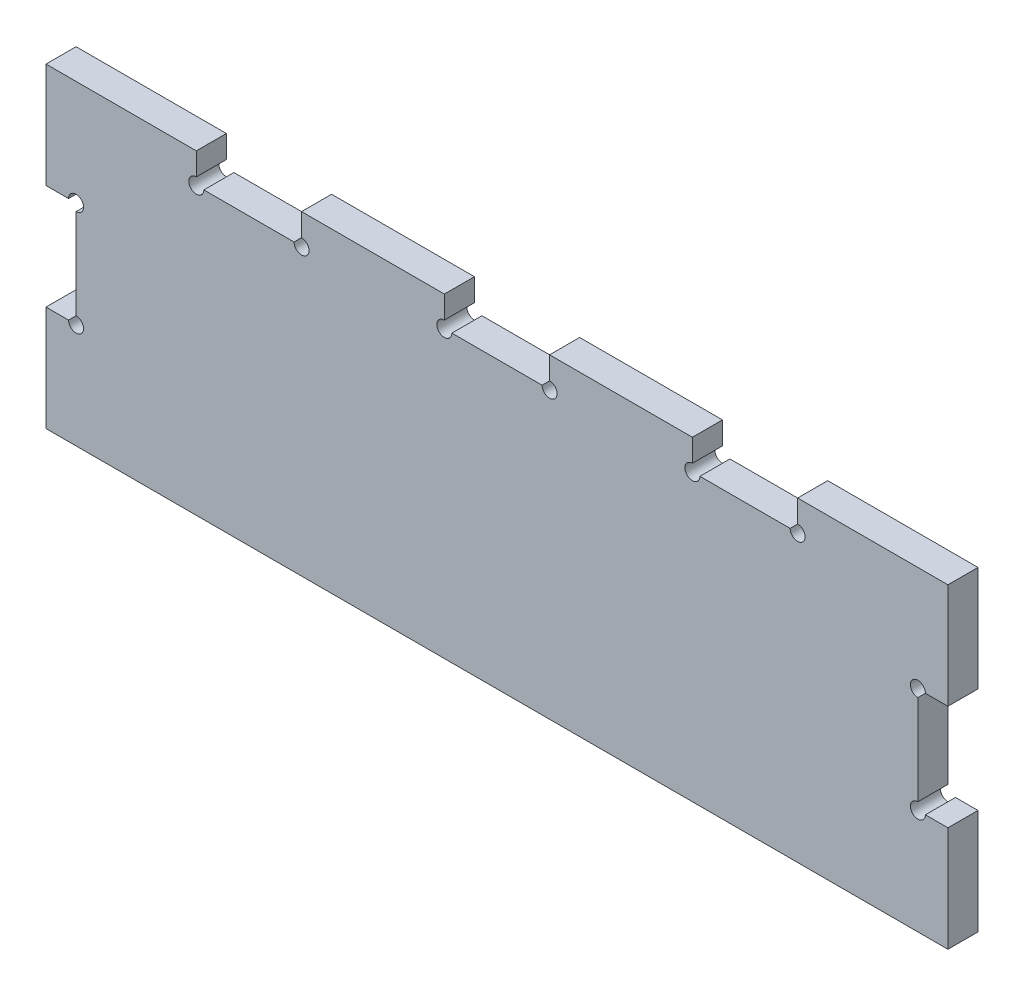
ISO-10303-21;
HEADER;
FILE_DESCRIPTION(('STEP AP214'),'2;1');
FILE_NAME('part.step','',(''),(''),'','','');
FILE_SCHEMA(('AUTOMOTIVE_DESIGN { 1 0 10303 214 1 1 1 1 }'));
ENDSEC;
DATA;
#1=APPLICATION_CONTEXT('core data for automotive mechanical design processes');
#2=APPLICATION_PROTOCOL_DEFINITION('international standard','automotive_design',2000,#1);
#3=PRODUCT_CONTEXT('',#1,'mechanical');
#4=PRODUCT('Part','Part','',(#3));
#5=PRODUCT_RELATED_PRODUCT_CATEGORY('part','',(#4));
#6=PRODUCT_DEFINITION_FORMATION('','',#4);
#7=PRODUCT_DEFINITION_CONTEXT('part definition',#1,'design');
#8=PRODUCT_DEFINITION('design','',#6,#7);
#9=PRODUCT_DEFINITION_SHAPE('','',#8);
#10=(LENGTH_UNIT() NAMED_UNIT(*) SI_UNIT(.MILLI.,.METRE.));
#11=(NAMED_UNIT(*) PLANE_ANGLE_UNIT() SI_UNIT($,.RADIAN.));
#12=(NAMED_UNIT(*) SI_UNIT($,.STERADIAN.) SOLID_ANGLE_UNIT());
#13=UNCERTAINTY_MEASURE_WITH_UNIT(LENGTH_MEASURE(1.E-05),#10,'distance_accuracy_value','');
#14=(GEOMETRIC_REPRESENTATION_CONTEXT(3) GLOBAL_UNCERTAINTY_ASSIGNED_CONTEXT((#13)) GLOBAL_UNIT_ASSIGNED_CONTEXT((#10,
#11,#12)) REPRESENTATION_CONTEXT('',''));
#15=CARTESIAN_POINT('',(0.,0.,0.));
#16=DIRECTION('',(0.,0.,1.));
#17=DIRECTION('',(1.,0.,0.));
#18=AXIS2_PLACEMENT_3D('',#15,#16,#17);
#19=CARTESIAN_POINT('',(0.,21.,2.));
#20=DIRECTION('',(0.,-1.,0.));
#21=DIRECTION('',(0.,0.,-1.));
#22=AXIS2_PLACEMENT_3D('',#19,#20,#21);
#23=PLANE('',#22);
#24=DIRECTION('',(-1.,0.,0.));
#25=VECTOR('',#24,1.);
#26=CARTESIAN_POINT('',(0.,21.,2.));
#27=LINE('',#26,#25);
#28=CARTESIAN_POINT('',(10.,21.,2.));
#29=VERTEX_POINT('',#28);
#30=CARTESIAN_POINT('',(0.,21.,2.));
#31=VERTEX_POINT('',#30);
#32=EDGE_CURVE('E440',#29,#31,#27,.T.);
#33=ORIENTED_EDGE('',*,*,#32,.F.);
#34=DIRECTION('',(0.,0.,1.));
#35=VECTOR('',#34,1.);
#36=CARTESIAN_POINT('',(10.,21.,0.));
#37=LINE('',#36,#35);
#38=CARTESIAN_POINT('',(10.,21.,0.));
#39=VERTEX_POINT('',#38);
#40=EDGE_CURVE('E303',#39,#29,#37,.T.);
#41=ORIENTED_EDGE('',*,*,#40,.F.);
#42=DIRECTION('',(-1.,0.,0.));
#43=VECTOR('',#42,1.);
#44=CARTESIAN_POINT('',(0.,21.,0.));
#45=LINE('',#44,#43);
#46=CARTESIAN_POINT('',(0.,21.,0.));
#47=VERTEX_POINT('',#46);
#48=EDGE_CURVE('E459',#39,#47,#45,.T.);
#49=ORIENTED_EDGE('',*,*,#48,.T.);
#50=DIRECTION('',(0.,0.,-1.));
#51=VECTOR('',#50,1.);
#52=CARTESIAN_POINT('',(0.,21.,2.));
#53=LINE('',#52,#51);
#54=EDGE_CURVE('E445',#31,#47,#53,.T.);
#55=ORIENTED_EDGE('',*,*,#54,.F.);
#56=EDGE_LOOP('',(#33,#41,#49,#55));
#57=FACE_BOUND('',#56,.T.);
#58=ADVANCED_FACE('F39',(#57),#23,.F.);
#59=CARTESIAN_POINT('',(26.5,21.,0.));
#60=VERTEX_POINT('',#59);
#61=CARTESIAN_POINT('',(17.,21.,0.));
#62=VERTEX_POINT('',#61);
#63=EDGE_CURVE('E689',#60,#62,#45,.T.);
#64=ORIENTED_EDGE('',*,*,#63,.T.);
#65=DIRECTION('',(0.,0.,1.));
#66=VECTOR('',#65,1.);
#67=CARTESIAN_POINT('',(17.,21.,0.));
#68=LINE('',#67,#66);
#69=CARTESIAN_POINT('',(17.,21.,2.));
#70=VERTEX_POINT('',#69);
#71=EDGE_CURVE('E307',#62,#70,#68,.T.);
#72=ORIENTED_EDGE('',*,*,#71,.T.);
#73=CARTESIAN_POINT('',(26.5,21.,2.));
#74=VERTEX_POINT('',#73);
#75=EDGE_CURVE('E289',#74,#70,#27,.T.);
#76=ORIENTED_EDGE('',*,*,#75,.F.);
#77=DIRECTION('',(0.,0.,1.));
#78=VECTOR('',#77,1.);
#79=CARTESIAN_POINT('',(26.5,21.,0.));
#80=LINE('',#79,#78);
#81=EDGE_CURVE('E334',#60,#74,#80,.T.);
#82=ORIENTED_EDGE('',*,*,#81,.F.);
#83=EDGE_LOOP('',(#64,#72,#76,#82));
#84=FACE_BOUND('',#83,.T.);
#85=ADVANCED_FACE('F714',(#84),#23,.F.);
#86=CARTESIAN_POINT('',(43.,21.,0.));
#87=VERTEX_POINT('',#86);
#88=CARTESIAN_POINT('',(33.5,21.,0.));
#89=VERTEX_POINT('',#88);
#90=EDGE_CURVE('E464',#87,#89,#45,.T.);
#91=ORIENTED_EDGE('',*,*,#90,.T.);
#92=DIRECTION('',(0.,0.,1.));
#93=VECTOR('',#92,1.);
#94=CARTESIAN_POINT('',(33.5,21.,0.));
#95=LINE('',#94,#93);
#96=CARTESIAN_POINT('',(33.5,21.,2.));
#97=VERTEX_POINT('',#96);
#98=EDGE_CURVE('E322',#89,#97,#95,.T.);
#99=ORIENTED_EDGE('',*,*,#98,.T.);
#100=CARTESIAN_POINT('',(43.,21.,2.));
#101=VERTEX_POINT('',#100);
#102=EDGE_CURVE('E446',#101,#97,#27,.T.);
#103=ORIENTED_EDGE('',*,*,#102,.F.);
#104=DIRECTION('',(0.,0.,1.));
#105=VECTOR('',#104,1.);
#106=CARTESIAN_POINT('',(43.,21.,0.));
#107=LINE('',#106,#105);
#108=EDGE_CURVE('E328',#87,#101,#107,.T.);
#109=ORIENTED_EDGE('',*,*,#108,.F.);
#110=EDGE_LOOP('',(#91,#99,#103,#109));
#111=FACE_BOUND('',#110,.T.);
#112=ADVANCED_FACE('F559',(#111),#23,.F.);
#113=CARTESIAN_POINT('',(0.,0.,2.));
#114=DIRECTION('',(1.,0.,0.));
#115=DIRECTION('',(0.,0.,-1.));
#116=AXIS2_PLACEMENT_3D('',#113,#114,#115);
#117=PLANE('',#116);
#118=DIRECTION('',(0.,-1.,0.));
#119=VECTOR('',#118,1.);
#120=CARTESIAN_POINT('',(0.,0.,0.));
#121=LINE('',#120,#119);
#122=CARTESIAN_POINT('',(0.,14.,0.));
#123=VERTEX_POINT('',#122);
#124=EDGE_CURVE('E447',#47,#123,#121,.T.);
#125=ORIENTED_EDGE('',*,*,#124,.T.);
#126=DIRECTION('',(0.,0.,1.));
#127=VECTOR('',#126,1.);
#128=CARTESIAN_POINT('',(0.,14.,0.));
#129=LINE('',#128,#127);
#130=CARTESIAN_POINT('',(0.,14.,2.));
#131=VERTEX_POINT('',#130);
#132=EDGE_CURVE('E393',#123,#131,#129,.T.);
#133=ORIENTED_EDGE('',*,*,#132,.T.);
#134=DIRECTION('',(0.,-1.,0.));
#135=VECTOR('',#134,1.);
#136=CARTESIAN_POINT('',(0.,0.,2.));
#137=LINE('',#136,#135);
#138=EDGE_CURVE('E427',#31,#131,#137,.T.);
#139=ORIENTED_EDGE('',*,*,#138,.F.);
#140=ORIENTED_EDGE('',*,*,#54,.T.);
#141=EDGE_LOOP('',(#125,#133,#139,#140));
#142=FACE_BOUND('',#141,.T.);
#143=ADVANCED_FACE('F693',(#142),#117,.F.);
#144=CARTESIAN_POINT('',(60.,0.,2.));
#145=DIRECTION('',(-1.,0.,0.));
#146=DIRECTION('',(0.,0.,1.));
#147=AXIS2_PLACEMENT_3D('',#144,#145,#146);
#148=PLANE('',#147);
#149=DIRECTION('',(0.,1.,0.));
#150=VECTOR('',#149,1.);
#151=CARTESIAN_POINT('',(60.,0.,0.));
#152=LINE('',#151,#150);
#153=CARTESIAN_POINT('',(60.,0.,0.));
#154=VERTEX_POINT('',#153);
#155=CARTESIAN_POINT('',(60.,7.00000000000002,0.));
#156=VERTEX_POINT('',#155);
#157=EDGE_CURVE('E455',#154,#156,#152,.T.);
#158=ORIENTED_EDGE('',*,*,#157,.T.);
#159=DIRECTION('',(0.,0.,1.));
#160=VECTOR('',#159,1.);
#161=CARTESIAN_POINT('',(60.,7.00000000000002,0.));
#162=LINE('',#161,#160);
#163=CARTESIAN_POINT('',(60.,7.00000000000002,2.));
#164=VERTEX_POINT('',#163);
#165=EDGE_CURVE('E387',#156,#164,#162,.T.);
#166=ORIENTED_EDGE('',*,*,#165,.T.);
#167=DIRECTION('',(0.,1.,0.));
#168=VECTOR('',#167,1.);
#169=CARTESIAN_POINT('',(60.,0.,2.));
#170=LINE('',#169,#168);
#171=CARTESIAN_POINT('',(60.,0.,2.));
#172=VERTEX_POINT('',#171);
#173=EDGE_CURVE('E436',#172,#164,#170,.T.);
#174=ORIENTED_EDGE('',*,*,#173,.F.);
#175=DIRECTION('',(0.,0.,-1.));
#176=VECTOR('',#175,1.);
#177=CARTESIAN_POINT('',(60.,0.,2.));
#178=LINE('',#177,#176);
#179=EDGE_CURVE('E472',#172,#154,#178,.T.);
#180=ORIENTED_EDGE('',*,*,#179,.T.);
#181=EDGE_LOOP('',(#158,#166,#174,#180));
#182=FACE_BOUND('',#181,.T.);
#183=ADVANCED_FACE('F673',(#182),#148,.F.);
#184=CARTESIAN_POINT('',(0.,7.,2.));
#185=VERTEX_POINT('',#184);
#186=CARTESIAN_POINT('',(0.,0.,2.));
#187=VERTEX_POINT('',#186);
#188=EDGE_CURVE('E432',#185,#187,#137,.T.);
#189=ORIENTED_EDGE('',*,*,#188,.F.);
#190=DIRECTION('',(0.,0.,1.));
#191=VECTOR('',#190,1.);
#192=CARTESIAN_POINT('',(0.,7.,0.));
#193=LINE('',#192,#191);
#194=CARTESIAN_POINT('',(0.,7.,0.));
#195=VERTEX_POINT('',#194);
#196=EDGE_CURVE('E381',#195,#185,#193,.T.);
#197=ORIENTED_EDGE('',*,*,#196,.F.);
#198=CARTESIAN_POINT('',(0.,0.,0.));
#199=VERTEX_POINT('',#198);
#200=EDGE_CURVE('E397',#195,#199,#121,.T.);
#201=ORIENTED_EDGE('',*,*,#200,.T.);
#202=DIRECTION('',(0.,0.,-1.));
#203=VECTOR('',#202,1.);
#204=CARTESIAN_POINT('',(0.,0.,2.));
#205=LINE('',#204,#203);
#206=EDGE_CURVE('E476',#187,#199,#205,.T.);
#207=ORIENTED_EDGE('',*,*,#206,.F.);
#208=EDGE_LOOP('',(#189,#197,#201,#207));
#209=FACE_BOUND('',#208,.T.);
#210=ADVANCED_FACE('F41',(#209),#117,.F.);
#211=CARTESIAN_POINT('',(0.,0.,2.));
#212=DIRECTION('',(0.,1.,0.));
#213=DIRECTION('',(0.,0.,1.));
#214=AXIS2_PLACEMENT_3D('',#211,#212,#213);
#215=PLANE('',#214);
#216=DIRECTION('',(1.,0.,0.));
#217=VECTOR('',#216,1.);
#218=CARTESIAN_POINT('',(0.,0.,0.));
#219=LINE('',#218,#217);
#220=EDGE_CURVE('E451',#199,#154,#219,.T.);
#221=ORIENTED_EDGE('',*,*,#220,.T.);
#222=ORIENTED_EDGE('',*,*,#179,.F.);
#223=DIRECTION('',(1.,0.,0.));
#224=VECTOR('',#223,1.);
#225=CARTESIAN_POINT('',(0.,0.,2.));
#226=LINE('',#225,#224);
#227=EDGE_CURVE('E431',#187,#172,#226,.T.);
#228=ORIENTED_EDGE('',*,*,#227,.F.);
#229=ORIENTED_EDGE('',*,*,#206,.T.);
#230=EDGE_LOOP('',(#221,#222,#228,#229));
#231=FACE_BOUND('',#230,.T.);
#232=ADVANCED_FACE('F680',(#231),#215,.F.);
#233=CARTESIAN_POINT('',(60.,14.,2.));
#234=VERTEX_POINT('',#233);
#235=CARTESIAN_POINT('',(60.,21.,2.));
#236=VERTEX_POINT('',#235);
#237=EDGE_CURVE('E435',#234,#236,#170,.T.);
#238=ORIENTED_EDGE('',*,*,#237,.F.);
#239=DIRECTION('',(0.,0.,1.));
#240=VECTOR('',#239,1.);
#241=CARTESIAN_POINT('',(60.,14.,0.));
#242=LINE('',#241,#240);
#243=CARTESIAN_POINT('',(60.,14.,0.));
#244=VERTEX_POINT('',#243);
#245=EDGE_CURVE('E412',#244,#234,#242,.T.);
#246=ORIENTED_EDGE('',*,*,#245,.F.);
#247=CARTESIAN_POINT('',(60.,21.,0.));
#248=VERTEX_POINT('',#247);
#249=EDGE_CURVE('E454',#244,#248,#152,.T.);
#250=ORIENTED_EDGE('',*,*,#249,.T.);
#251=DIRECTION('',(0.,0.,-1.));
#252=VECTOR('',#251,1.);
#253=CARTESIAN_POINT('',(60.,21.,2.));
#254=LINE('',#253,#252);
#255=EDGE_CURVE('E468',#236,#248,#254,.T.);
#256=ORIENTED_EDGE('',*,*,#255,.F.);
#257=EDGE_LOOP('',(#238,#246,#250,#256));
#258=FACE_BOUND('',#257,.T.);
#259=ADVANCED_FACE('F724',(#258),#148,.F.);
#260=CARTESIAN_POINT('',(50.,21.,0.));
#261=VERTEX_POINT('',#260);
#262=EDGE_CURVE('E460',#248,#261,#45,.T.);
#263=ORIENTED_EDGE('',*,*,#262,.T.);
#264=DIRECTION('',(0.,0.,1.));
#265=VECTOR('',#264,1.);
#266=CARTESIAN_POINT('',(50.,21.,0.));
#267=LINE('',#266,#265);
#268=CARTESIAN_POINT('',(50.,21.,2.));
#269=VERTEX_POINT('',#268);
#270=EDGE_CURVE('E352',#261,#269,#267,.T.);
#271=ORIENTED_EDGE('',*,*,#270,.T.);
#272=EDGE_CURVE('E441',#236,#269,#27,.T.);
#273=ORIENTED_EDGE('',*,*,#272,.F.);
#274=ORIENTED_EDGE('',*,*,#255,.T.);
#275=EDGE_LOOP('',(#263,#271,#273,#274));
#276=FACE_BOUND('',#275,.T.);
#277=ADVANCED_FACE('F716',(#276),#23,.F.);
#278=CARTESIAN_POINT('',(0.,0.,2.));
#279=DIRECTION('',(0.,0.,-1.));
#280=DIRECTION('',(-1.,0.,0.));
#281=AXIS2_PLACEMENT_3D('',#278,#279,#280);
#282=PLANE('',#281);
#283=DIRECTION('',(1.,0.,0.));
#284=VECTOR('',#283,1.);
#285=CARTESIAN_POINT('',(10.,19.,2.));
#286=LINE('',#285,#284);
#287=CARTESIAN_POINT('',(10.5,19.,2.));
#288=VERTEX_POINT('',#287);
#289=CARTESIAN_POINT('',(16.5,19.,2.));
#290=VERTEX_POINT('',#289);
#291=EDGE_CURVE('E292',#288,#290,#286,.T.);
#292=ORIENTED_EDGE('',*,*,#291,.F.);
#293=CARTESIAN_POINT('',(10.,19.,2.));
#294=DIRECTION('',(0.,0.,1.));
#295=DIRECTION('',(1.,0.,0.));
#296=AXIS2_PLACEMENT_3D('',#293,#294,#295);
#297=CIRCLE('',#296,0.5);
#298=CARTESIAN_POINT('',(10.,19.5,2.));
#299=VERTEX_POINT('',#298);
#300=EDGE_CURVE('E543',#299,#288,#297,.T.);
#301=ORIENTED_EDGE('',*,*,#300,.F.);
#302=DIRECTION('',(0.,-1.,0.));
#303=VECTOR('',#302,1.);
#304=CARTESIAN_POINT('',(10.,21.,2.));
#305=LINE('',#304,#303);
#306=EDGE_CURVE('E299',#29,#299,#305,.T.);
#307=ORIENTED_EDGE('',*,*,#306,.F.);
#308=ORIENTED_EDGE('',*,*,#32,.T.);
#309=ORIENTED_EDGE('',*,*,#138,.T.);
#310=DIRECTION('',(-1.,0.,0.));
#311=VECTOR('',#310,1.);
#312=CARTESIAN_POINT('',(0.,14.,2.));
#313=LINE('',#312,#311);
#314=CARTESIAN_POINT('',(1.5,14.,2.));
#315=VERTEX_POINT('',#314);
#316=EDGE_CURVE('E374',#315,#131,#313,.T.);
#317=ORIENTED_EDGE('',*,*,#316,.F.);
#318=CARTESIAN_POINT('',(2.,14.,2.));
#319=DIRECTION('',(0.,0.,1.));
#320=DIRECTION('',(1.,0.,0.));
#321=AXIS2_PLACEMENT_3D('',#318,#319,#320);
#322=CIRCLE('',#321,0.5);
#323=CARTESIAN_POINT('',(2.,13.5,2.));
#324=VERTEX_POINT('',#323);
#325=EDGE_CURVE('E615',#324,#315,#322,.T.);
#326=ORIENTED_EDGE('',*,*,#325,.F.);
#327=DIRECTION('',(0.,1.,0.));
#328=VECTOR('',#327,1.);
#329=CARTESIAN_POINT('',(2.,14.,2.));
#330=LINE('',#329,#328);
#331=CARTESIAN_POINT('',(2.,7.5,2.));
#332=VERTEX_POINT('',#331);
#333=EDGE_CURVE('E386',#332,#324,#330,.T.);
#334=ORIENTED_EDGE('',*,*,#333,.F.);
#335=CARTESIAN_POINT('',(2.,7.,2.));
#336=DIRECTION('',(0.,0.,1.));
#337=DIRECTION('',(1.,0.,0.));
#338=AXIS2_PLACEMENT_3D('',#335,#336,#337);
#339=CIRCLE('',#338,0.5);
#340=CARTESIAN_POINT('',(1.5,7.,2.));
#341=VERTEX_POINT('',#340);
#342=EDGE_CURVE('E598',#341,#332,#339,.T.);
#343=ORIENTED_EDGE('',*,*,#342,.F.);
#344=DIRECTION('',(1.,0.,0.));
#345=VECTOR('',#344,1.);
#346=CARTESIAN_POINT('',(0.,7.,2.));
#347=LINE('',#346,#345);
#348=EDGE_CURVE('E382',#185,#341,#347,.T.);
#349=ORIENTED_EDGE('',*,*,#348,.F.);
#350=ORIENTED_EDGE('',*,*,#188,.T.);
#351=ORIENTED_EDGE('',*,*,#227,.T.);
#352=ORIENTED_EDGE('',*,*,#173,.T.);
#353=DIRECTION('',(1.,0.,0.));
#354=VECTOR('',#353,1.);
#355=CARTESIAN_POINT('',(60.,7.00000000000002,2.));
#356=LINE('',#355,#354);
#357=CARTESIAN_POINT('',(58.5,7.00000000000002,2.));
#358=VERTEX_POINT('',#357);
#359=EDGE_CURVE('E405',#358,#164,#356,.T.);
#360=ORIENTED_EDGE('',*,*,#359,.F.);
#361=CARTESIAN_POINT('',(58.,7.00000000000002,2.));
#362=DIRECTION('',(0.,0.,1.));
#363=DIRECTION('',(1.,0.,0.));
#364=AXIS2_PLACEMENT_3D('',#361,#362,#363);
#365=CIRCLE('',#364,0.5);
#366=CARTESIAN_POINT('',(58.,7.50000000000002,2.));
#367=VERTEX_POINT('',#366);
#368=EDGE_CURVE('E661',#367,#358,#365,.T.);
#369=ORIENTED_EDGE('',*,*,#368,.F.);
#370=DIRECTION('',(0.,-1.,0.));
#371=VECTOR('',#370,1.);
#372=CARTESIAN_POINT('',(58.,14.,2.));
#373=LINE('',#372,#371);
#374=CARTESIAN_POINT('',(58.,13.5,2.));
#375=VERTEX_POINT('',#374);
#376=EDGE_CURVE('E416',#375,#367,#373,.T.);
#377=ORIENTED_EDGE('',*,*,#376,.F.);
#378=CARTESIAN_POINT('',(58.,14.,2.));
#379=DIRECTION('',(0.,0.,1.));
#380=DIRECTION('',(1.,0.,0.));
#381=AXIS2_PLACEMENT_3D('',#378,#379,#380);
#382=CIRCLE('',#381,0.5);
#383=CARTESIAN_POINT('',(58.5,14.,2.));
#384=VERTEX_POINT('',#383);
#385=EDGE_CURVE('E626',#384,#375,#382,.T.);
#386=ORIENTED_EDGE('',*,*,#385,.F.);
#387=DIRECTION('',(-1.,0.,0.));
#388=VECTOR('',#387,1.);
#389=CARTESIAN_POINT('',(60.,14.,2.));
#390=LINE('',#389,#388);
#391=EDGE_CURVE('E306',#234,#384,#390,.T.);
#392=ORIENTED_EDGE('',*,*,#391,.F.);
#393=ORIENTED_EDGE('',*,*,#237,.T.);
#394=ORIENTED_EDGE('',*,*,#272,.T.);
#395=DIRECTION('',(0.,1.,0.));
#396=VECTOR('',#395,1.);
#397=CARTESIAN_POINT('',(50.,21.,2.));
#398=LINE('',#397,#396);
#399=CARTESIAN_POINT('',(50.,19.5,2.));
#400=VERTEX_POINT('',#399);
#401=EDGE_CURVE('E345',#400,#269,#398,.T.);
#402=ORIENTED_EDGE('',*,*,#401,.F.);
#403=CARTESIAN_POINT('',(50.,19.,2.));
#404=DIRECTION('',(0.,0.,1.));
#405=DIRECTION('',(1.,0.,0.));
#406=AXIS2_PLACEMENT_3D('',#403,#404,#405);
#407=CIRCLE('',#406,0.5);
#408=CARTESIAN_POINT('',(49.5,19.,2.));
#409=VERTEX_POINT('',#408);
#410=EDGE_CURVE('E631',#409,#400,#407,.T.);
#411=ORIENTED_EDGE('',*,*,#410,.F.);
#412=DIRECTION('',(1.,0.,0.));
#413=VECTOR('',#412,1.);
#414=CARTESIAN_POINT('',(43.,19.,2.));
#415=LINE('',#414,#413);
#416=CARTESIAN_POINT('',(43.5,19.,2.));
#417=VERTEX_POINT('',#416);
#418=EDGE_CURVE('E357',#417,#409,#415,.T.);
#419=ORIENTED_EDGE('',*,*,#418,.F.);
#420=CARTESIAN_POINT('',(43.,19.,2.));
#421=DIRECTION('',(0.,0.,1.));
#422=DIRECTION('',(1.,0.,0.));
#423=AXIS2_PLACEMENT_3D('',#420,#421,#422);
#424=CIRCLE('',#423,0.5);
#425=CARTESIAN_POINT('',(43.,19.5,2.));
#426=VERTEX_POINT('',#425);
#427=EDGE_CURVE('E638',#426,#417,#424,.T.);
#428=ORIENTED_EDGE('',*,*,#427,.F.);
#429=DIRECTION('',(0.,-1.,0.));
#430=VECTOR('',#429,1.);
#431=CARTESIAN_POINT('',(43.,21.,2.));
#432=LINE('',#431,#430);
#433=EDGE_CURVE('E353',#101,#426,#432,.T.);
#434=ORIENTED_EDGE('',*,*,#433,.F.);
#435=ORIENTED_EDGE('',*,*,#102,.T.);
#436=DIRECTION('',(0.,1.,0.));
#437=VECTOR('',#436,1.);
#438=CARTESIAN_POINT('',(33.5,21.,2.));
#439=LINE('',#438,#437);
#440=CARTESIAN_POINT('',(33.5,19.5,2.));
#441=VERTEX_POINT('',#440);
#442=EDGE_CURVE('E315',#441,#97,#439,.T.);
#443=ORIENTED_EDGE('',*,*,#442,.F.);
#444=CARTESIAN_POINT('',(33.5,19.,2.));
#445=DIRECTION('',(0.,0.,1.));
#446=DIRECTION('',(1.,0.,0.));
#447=AXIS2_PLACEMENT_3D('',#444,#445,#446);
#448=CIRCLE('',#447,0.5);
#449=CARTESIAN_POINT('',(33.,19.,2.));
#450=VERTEX_POINT('',#449);
#451=EDGE_CURVE('E645',#450,#441,#448,.T.);
#452=ORIENTED_EDGE('',*,*,#451,.F.);
#453=DIRECTION('',(1.,0.,0.));
#454=VECTOR('',#453,1.);
#455=CARTESIAN_POINT('',(26.5,19.,2.));
#456=LINE('',#455,#454);
#457=CARTESIAN_POINT('',(27.,19.,2.));
#458=VERTEX_POINT('',#457);
#459=EDGE_CURVE('E327',#458,#450,#456,.T.);
#460=ORIENTED_EDGE('',*,*,#459,.F.);
#461=CARTESIAN_POINT('',(26.5,19.,2.));
#462=DIRECTION('',(0.,0.,1.));
#463=DIRECTION('',(1.,0.,0.));
#464=AXIS2_PLACEMENT_3D('',#461,#462,#463);
#465=CIRCLE('',#464,0.5);
#466=CARTESIAN_POINT('',(26.5,19.5,2.));
#467=VERTEX_POINT('',#466);
#468=EDGE_CURVE('E651',#467,#458,#465,.T.);
#469=ORIENTED_EDGE('',*,*,#468,.F.);
#470=DIRECTION('',(0.,-1.,0.));
#471=VECTOR('',#470,1.);
#472=CARTESIAN_POINT('',(26.5,21.,2.));
#473=LINE('',#472,#471);
#474=EDGE_CURVE('E323',#74,#467,#473,.T.);
#475=ORIENTED_EDGE('',*,*,#474,.F.);
#476=ORIENTED_EDGE('',*,*,#75,.T.);
#477=DIRECTION('',(0.,1.,0.));
#478=VECTOR('',#477,1.);
#479=CARTESIAN_POINT('',(17.,21.,2.));
#480=LINE('',#479,#478);
#481=CARTESIAN_POINT('',(17.,19.5,2.));
#482=VERTEX_POINT('',#481);
#483=EDGE_CURVE('E278',#482,#70,#480,.T.);
#484=ORIENTED_EDGE('',*,*,#483,.F.);
#485=CARTESIAN_POINT('',(17.,19.,2.));
#486=DIRECTION('',(0.,0.,1.));
#487=DIRECTION('',(1.,0.,0.));
#488=AXIS2_PLACEMENT_3D('',#485,#486,#487);
#489=CIRCLE('',#488,0.5);
#490=EDGE_CURVE('E259',#290,#482,#489,.T.);
#491=ORIENTED_EDGE('',*,*,#490,.F.);
#492=EDGE_LOOP('',(#292,#301,#307,#308,#309,#317,#326,#334,#343,#349,#350,#351,#352,#360,#369,
#377,#386,#392,#393,#394,#402,#411,#419,#428,#434,#435,#443,#452,#460,#469,#475,#476,#484,#491));
#493=FACE_BOUND('',#492,.T.);
#494=ADVANCED_FACE('F286',(#493),#282,.F.);
#495=CARTESIAN_POINT('',(0.,0.,0.));
#496=DIRECTION('',(0.,0.,-1.));
#497=DIRECTION('',(-1.,0.,0.));
#498=AXIS2_PLACEMENT_3D('',#495,#496,#497);
#499=PLANE('',#498);
#500=CARTESIAN_POINT('',(10.,19.,0.));
#501=DIRECTION('',(0.,0.,1.));
#502=DIRECTION('',(1.,0.,0.));
#503=AXIS2_PLACEMENT_3D('',#500,#501,#502);
#504=CIRCLE('',#503,0.5);
#505=CARTESIAN_POINT('',(10.,19.5,0.));
#506=VERTEX_POINT('',#505);
#507=CARTESIAN_POINT('',(10.5,19.,0.));
#508=VERTEX_POINT('',#507);
#509=EDGE_CURVE('E618',#506,#508,#504,.T.);
#510=ORIENTED_EDGE('',*,*,#509,.T.);
#511=DIRECTION('',(1.,0.,0.));
#512=VECTOR('',#511,1.);
#513=CARTESIAN_POINT('',(10.,19.,0.));
#514=LINE('',#513,#512);
#515=CARTESIAN_POINT('',(16.5,19.,0.));
#516=VERTEX_POINT('',#515);
#517=EDGE_CURVE('E297',#508,#516,#514,.T.);
#518=ORIENTED_EDGE('',*,*,#517,.T.);
#519=CARTESIAN_POINT('',(17.,19.,0.));
#520=DIRECTION('',(0.,0.,1.));
#521=DIRECTION('',(1.,0.,0.));
#522=AXIS2_PLACEMENT_3D('',#519,#520,#521);
#523=CIRCLE('',#522,0.5);
#524=CARTESIAN_POINT('',(17.,19.5,0.));
#525=VERTEX_POINT('',#524);
#526=EDGE_CURVE('E271',#516,#525,#523,.T.);
#527=ORIENTED_EDGE('',*,*,#526,.T.);
#528=DIRECTION('',(0.,1.,0.));
#529=VECTOR('',#528,1.);
#530=CARTESIAN_POINT('',(17.,21.,0.));
#531=LINE('',#530,#529);
#532=EDGE_CURVE('E280',#525,#62,#531,.T.);
#533=ORIENTED_EDGE('',*,*,#532,.T.);
#534=ORIENTED_EDGE('',*,*,#63,.F.);
#535=DIRECTION('',(0.,-1.,0.));
#536=VECTOR('',#535,1.);
#537=CARTESIAN_POINT('',(26.5,21.,0.));
#538=LINE('',#537,#536);
#539=CARTESIAN_POINT('',(26.5,19.5,0.));
#540=VERTEX_POINT('',#539);
#541=EDGE_CURVE('E310',#60,#540,#538,.T.);
#542=ORIENTED_EDGE('',*,*,#541,.T.);
#543=CARTESIAN_POINT('',(26.5,19.,0.));
#544=DIRECTION('',(0.,0.,1.));
#545=DIRECTION('',(1.,0.,0.));
#546=AXIS2_PLACEMENT_3D('',#543,#544,#545);
#547=CIRCLE('',#546,0.5);
#548=CARTESIAN_POINT('',(27.,19.,0.));
#549=VERTEX_POINT('',#548);
#550=EDGE_CURVE('E272',#540,#549,#547,.T.);
#551=ORIENTED_EDGE('',*,*,#550,.T.);
#552=DIRECTION('',(1.,0.,0.));
#553=VECTOR('',#552,1.);
#554=CARTESIAN_POINT('',(26.5,19.,0.));
#555=LINE('',#554,#553);
#556=CARTESIAN_POINT('',(33.,19.,0.));
#557=VERTEX_POINT('',#556);
#558=EDGE_CURVE('E314',#549,#557,#555,.T.);
#559=ORIENTED_EDGE('',*,*,#558,.T.);
#560=CARTESIAN_POINT('',(33.5,19.,0.));
#561=DIRECTION('',(0.,0.,1.));
#562=DIRECTION('',(1.,0.,0.));
#563=AXIS2_PLACEMENT_3D('',#560,#561,#562);
#564=CIRCLE('',#563,0.5);
#565=CARTESIAN_POINT('',(33.5,19.5,0.));
#566=VERTEX_POINT('',#565);
#567=EDGE_CURVE('E648',#557,#566,#564,.T.);
#568=ORIENTED_EDGE('',*,*,#567,.T.);
#569=DIRECTION('',(0.,1.,0.));
#570=VECTOR('',#569,1.);
#571=CARTESIAN_POINT('',(33.5,21.,0.));
#572=LINE('',#571,#570);
#573=EDGE_CURVE('E319',#566,#89,#572,.T.);
#574=ORIENTED_EDGE('',*,*,#573,.T.);
#575=ORIENTED_EDGE('',*,*,#90,.F.);
#576=DIRECTION('',(0.,-1.,0.));
#577=VECTOR('',#576,1.);
#578=CARTESIAN_POINT('',(43.,21.,0.));
#579=LINE('',#578,#577);
#580=CARTESIAN_POINT('',(43.,19.5,0.));
#581=VERTEX_POINT('',#580);
#582=EDGE_CURVE('E340',#87,#581,#579,.T.);
#583=ORIENTED_EDGE('',*,*,#582,.T.);
#584=CARTESIAN_POINT('',(43.,19.,0.));
#585=DIRECTION('',(0.,0.,1.));
#586=DIRECTION('',(1.,0.,0.));
#587=AXIS2_PLACEMENT_3D('',#584,#585,#586);
#588=CIRCLE('',#587,0.5);
#589=CARTESIAN_POINT('',(43.5,19.,0.));
#590=VERTEX_POINT('',#589);
#591=EDGE_CURVE('E641',#581,#590,#588,.T.);
#592=ORIENTED_EDGE('',*,*,#591,.T.);
#593=DIRECTION('',(1.,0.,0.));
#594=VECTOR('',#593,1.);
#595=CARTESIAN_POINT('',(43.,19.,0.));
#596=LINE('',#595,#594);
#597=CARTESIAN_POINT('',(49.5,19.,0.));
#598=VERTEX_POINT('',#597);
#599=EDGE_CURVE('E344',#590,#598,#596,.T.);
#600=ORIENTED_EDGE('',*,*,#599,.T.);
#601=CARTESIAN_POINT('',(50.,19.,0.));
#602=DIRECTION('',(0.,0.,1.));
#603=DIRECTION('',(1.,0.,0.));
#604=AXIS2_PLACEMENT_3D('',#601,#602,#603);
#605=CIRCLE('',#604,0.5);
#606=CARTESIAN_POINT('',(50.,19.5,0.));
#607=VERTEX_POINT('',#606);
#608=EDGE_CURVE('E634',#598,#607,#605,.T.);
#609=ORIENTED_EDGE('',*,*,#608,.T.);
#610=DIRECTION('',(0.,1.,0.));
#611=VECTOR('',#610,1.);
#612=CARTESIAN_POINT('',(50.,21.,0.));
#613=LINE('',#612,#611);
#614=EDGE_CURVE('E349',#607,#261,#613,.T.);
#615=ORIENTED_EDGE('',*,*,#614,.T.);
#616=ORIENTED_EDGE('',*,*,#262,.F.);
#617=ORIENTED_EDGE('',*,*,#249,.F.);
#618=DIRECTION('',(-1.,0.,0.));
#619=VECTOR('',#618,1.);
#620=CARTESIAN_POINT('',(60.,14.,0.));
#621=LINE('',#620,#619);
#622=CARTESIAN_POINT('',(58.5,14.,0.));
#623=VERTEX_POINT('',#622);
#624=EDGE_CURVE('E400',#244,#623,#621,.T.);
#625=ORIENTED_EDGE('',*,*,#624,.T.);
#626=CARTESIAN_POINT('',(58.,14.,0.));
#627=DIRECTION('',(0.,0.,1.));
#628=DIRECTION('',(1.,0.,0.));
#629=AXIS2_PLACEMENT_3D('',#626,#627,#628);
#630=CIRCLE('',#629,0.5);
#631=CARTESIAN_POINT('',(58.,13.5,0.));
#632=VERTEX_POINT('',#631);
#633=EDGE_CURVE('E62',#623,#632,#630,.T.);
#634=ORIENTED_EDGE('',*,*,#633,.T.);
#635=DIRECTION('',(0.,-1.,0.));
#636=VECTOR('',#635,1.);
#637=CARTESIAN_POINT('',(58.,14.,0.));
#638=LINE('',#637,#636);
#639=CARTESIAN_POINT('',(58.,7.50000000000003,0.));
#640=VERTEX_POINT('',#639);
#641=EDGE_CURVE('E404',#632,#640,#638,.T.);
#642=ORIENTED_EDGE('',*,*,#641,.T.);
#643=CARTESIAN_POINT('',(58.,7.00000000000002,0.));
#644=DIRECTION('',(0.,0.,1.));
#645=DIRECTION('',(1.,0.,0.));
#646=AXIS2_PLACEMENT_3D('',#643,#644,#645);
#647=CIRCLE('',#646,0.5);
#648=CARTESIAN_POINT('',(58.5,7.00000000000002,0.));
#649=VERTEX_POINT('',#648);
#650=EDGE_CURVE('E55',#640,#649,#647,.T.);
#651=ORIENTED_EDGE('',*,*,#650,.T.);
#652=DIRECTION('',(1.,0.,0.));
#653=VECTOR('',#652,1.);
#654=CARTESIAN_POINT('',(60.,7.00000000000002,0.));
#655=LINE('',#654,#653);
#656=EDGE_CURVE('E409',#649,#156,#655,.T.);
#657=ORIENTED_EDGE('',*,*,#656,.T.);
#658=ORIENTED_EDGE('',*,*,#157,.F.);
#659=ORIENTED_EDGE('',*,*,#220,.F.);
#660=ORIENTED_EDGE('',*,*,#200,.F.);
#661=DIRECTION('',(1.,0.,0.));
#662=VECTOR('',#661,1.);
#663=CARTESIAN_POINT('',(0.,7.,0.));
#664=LINE('',#663,#662);
#665=CARTESIAN_POINT('',(1.5,7.,0.));
#666=VERTEX_POINT('',#665);
#667=EDGE_CURVE('E369',#195,#666,#664,.T.);
#668=ORIENTED_EDGE('',*,*,#667,.T.);
#669=CARTESIAN_POINT('',(2.,7.,0.));
#670=DIRECTION('',(0.,0.,1.));
#671=DIRECTION('',(1.,0.,0.));
#672=AXIS2_PLACEMENT_3D('',#669,#670,#671);
#673=CIRCLE('',#672,0.5);
#674=CARTESIAN_POINT('',(2.,7.5,0.));
#675=VERTEX_POINT('',#674);
#676=EDGE_CURVE('E599',#666,#675,#673,.T.);
#677=ORIENTED_EDGE('',*,*,#676,.T.);
#678=DIRECTION('',(0.,1.,0.));
#679=VECTOR('',#678,1.);
#680=CARTESIAN_POINT('',(2.,14.,0.));
#681=LINE('',#680,#679);
#682=CARTESIAN_POINT('',(2.,13.5,0.));
#683=VERTEX_POINT('',#682);
#684=EDGE_CURVE('E373',#675,#683,#681,.T.);
#685=ORIENTED_EDGE('',*,*,#684,.T.);
#686=CARTESIAN_POINT('',(2.,14.,0.));
#687=DIRECTION('',(0.,0.,1.));
#688=DIRECTION('',(1.,0.,0.));
#689=AXIS2_PLACEMENT_3D('',#686,#687,#688);
#690=CIRCLE('',#689,0.5);
#691=CARTESIAN_POINT('',(1.5,14.,0.));
#692=VERTEX_POINT('',#691);
#693=EDGE_CURVE('E283',#683,#692,#690,.T.);
#694=ORIENTED_EDGE('',*,*,#693,.T.);
#695=DIRECTION('',(-1.,0.,0.));
#696=VECTOR('',#695,1.);
#697=CARTESIAN_POINT('',(0.,14.,0.));
#698=LINE('',#697,#696);
#699=EDGE_CURVE('E378',#692,#123,#698,.T.);
#700=ORIENTED_EDGE('',*,*,#699,.T.);
#701=ORIENTED_EDGE('',*,*,#124,.F.);
#702=ORIENTED_EDGE('',*,*,#48,.F.);
#703=DIRECTION('',(0.,-1.,0.));
#704=VECTOR('',#703,1.);
#705=CARTESIAN_POINT('',(10.,21.,0.));
#706=LINE('',#705,#704);
#707=EDGE_CURVE('E291',#39,#506,#706,.T.);
#708=ORIENTED_EDGE('',*,*,#707,.T.);
#709=EDGE_LOOP('',(#510,#518,#527,#533,#534,#542,#551,#559,#568,#574,#575,#583,#592,#600,#609,
#615,#616,#617,#625,#634,#642,#651,#657,#658,#659,#660,#668,#677,#685,#694,#700,#701,#702,#708));
#710=FACE_BOUND('',#709,.T.);
#711=ADVANCED_FACE('F518',(#710),#499,.T.);
#712=CARTESIAN_POINT('',(60.,7.00000000000002,0.));
#713=DIRECTION('',(0.,-1.,0.));
#714=DIRECTION('',(0.,0.,-1.));
#715=AXIS2_PLACEMENT_3D('',#712,#713,#714);
#716=PLANE('',#715);
#717=ORIENTED_EDGE('',*,*,#656,.F.);
#718=DIRECTION('',(0.,0.,1.));
#719=VECTOR('',#718,1.);
#720=CARTESIAN_POINT('',(58.5,7.00000000000002,0.));
#721=LINE('',#720,#719);
#722=EDGE_CURVE('E594',#649,#358,#721,.T.);
#723=ORIENTED_EDGE('',*,*,#722,.T.);
#724=ORIENTED_EDGE('',*,*,#359,.T.);
#725=ORIENTED_EDGE('',*,*,#165,.F.);
#726=EDGE_LOOP('',(#717,#723,#724,#725));
#727=FACE_BOUND('',#726,.T.);
#728=ADVANCED_FACE('F669',(#727),#716,.F.);
#729=CARTESIAN_POINT('',(58.,14.,0.));
#730=DIRECTION('',(-1.,0.,0.));
#731=DIRECTION('',(0.,-1.,0.));
#732=AXIS2_PLACEMENT_3D('',#729,#730,#731);
#733=PLANE('',#732);
#734=ORIENTED_EDGE('',*,*,#641,.F.);
#735=DIRECTION('',(0.,0.,1.));
#736=VECTOR('',#735,1.);
#737=CARTESIAN_POINT('',(58.,13.5,0.));
#738=LINE('',#737,#736);
#739=EDGE_CURVE('E590',#632,#375,#738,.T.);
#740=ORIENTED_EDGE('',*,*,#739,.T.);
#741=ORIENTED_EDGE('',*,*,#376,.T.);
#742=DIRECTION('',(0.,0.,1.));
#743=VECTOR('',#742,1.);
#744=CARTESIAN_POINT('',(58.,7.50000000000002,0.));
#745=LINE('',#744,#743);
#746=EDGE_CURVE('E11',#367,#640,#745,.F.);
#747=ORIENTED_EDGE('',*,*,#746,.T.);
#748=EDGE_LOOP('',(#734,#740,#741,#747));
#749=FACE_BOUND('',#748,.T.);
#750=ADVANCED_FACE('F811',(#749),#733,.F.);
#751=CARTESIAN_POINT('',(60.,14.,0.));
#752=DIRECTION('',(0.,1.,0.));
#753=DIRECTION('',(0.,0.,1.));
#754=AXIS2_PLACEMENT_3D('',#751,#752,#753);
#755=PLANE('',#754);
#756=ORIENTED_EDGE('',*,*,#391,.T.);
#757=DIRECTION('',(0.,0.,1.));
#758=VECTOR('',#757,1.);
#759=CARTESIAN_POINT('',(58.5,14.,0.));
#760=LINE('',#759,#758);
#761=EDGE_CURVE('E48',#384,#623,#760,.F.);
#762=ORIENTED_EDGE('',*,*,#761,.T.);
#763=ORIENTED_EDGE('',*,*,#624,.F.);
#764=ORIENTED_EDGE('',*,*,#245,.T.);
#765=EDGE_LOOP('',(#756,#762,#763,#764));
#766=FACE_BOUND('',#765,.T.);
#767=ADVANCED_FACE('F511',(#766),#755,.F.);
#768=CARTESIAN_POINT('',(0.,14.,0.));
#769=DIRECTION('',(0.,1.,0.));
#770=DIRECTION('',(-1.,0.,0.));
#771=AXIS2_PLACEMENT_3D('',#768,#769,#770);
#772=PLANE('',#771);
#773=ORIENTED_EDGE('',*,*,#699,.F.);
#774=DIRECTION('',(0.,0.,1.));
#775=VECTOR('',#774,1.);
#776=CARTESIAN_POINT('',(1.5,14.,0.));
#777=LINE('',#776,#775);
#778=EDGE_CURVE('E586',#692,#315,#777,.T.);
#779=ORIENTED_EDGE('',*,*,#778,.T.);
#780=ORIENTED_EDGE('',*,*,#316,.T.);
#781=ORIENTED_EDGE('',*,*,#132,.F.);
#782=EDGE_LOOP('',(#773,#779,#780,#781));
#783=FACE_BOUND('',#782,.T.);
#784=ADVANCED_FACE('F697',(#783),#772,.F.);
#785=CARTESIAN_POINT('',(2.,14.,0.));
#786=DIRECTION('',(1.,0.,0.));
#787=DIRECTION('',(0.,1.,0.));
#788=AXIS2_PLACEMENT_3D('',#785,#786,#787);
#789=PLANE('',#788);
#790=ORIENTED_EDGE('',*,*,#333,.T.);
#791=DIRECTION('',(0.,0.,1.));
#792=VECTOR('',#791,1.);
#793=CARTESIAN_POINT('',(2.,13.5,0.));
#794=LINE('',#793,#792);
#795=EDGE_CURVE('E506',#324,#683,#794,.F.);
#796=ORIENTED_EDGE('',*,*,#795,.T.);
#797=ORIENTED_EDGE('',*,*,#684,.F.);
#798=DIRECTION('',(0.,0.,1.));
#799=VECTOR('',#798,1.);
#800=CARTESIAN_POINT('',(2.,7.5,0.));
#801=LINE('',#800,#799);
#802=EDGE_CURVE('E358',#675,#332,#801,.T.);
#803=ORIENTED_EDGE('',*,*,#802,.T.);
#804=EDGE_LOOP('',(#790,#796,#797,#803));
#805=FACE_BOUND('',#804,.T.);
#806=ADVANCED_FACE('F609',(#805),#789,.F.);
#807=CARTESIAN_POINT('',(0.,7.,0.));
#808=DIRECTION('',(0.,-1.,0.));
#809=DIRECTION('',(1.,0.,0.));
#810=AXIS2_PLACEMENT_3D('',#807,#808,#809);
#811=PLANE('',#810);
#812=ORIENTED_EDGE('',*,*,#348,.T.);
#813=DIRECTION('',(0.,0.,1.));
#814=VECTOR('',#813,1.);
#815=CARTESIAN_POINT('',(1.5,7.,0.));
#816=LINE('',#815,#814);
#817=EDGE_CURVE('E480',#341,#666,#816,.F.);
#818=ORIENTED_EDGE('',*,*,#817,.T.);
#819=ORIENTED_EDGE('',*,*,#667,.F.);
#820=ORIENTED_EDGE('',*,*,#196,.T.);
#821=EDGE_LOOP('',(#812,#818,#819,#820));
#822=FACE_BOUND('',#821,.T.);
#823=ADVANCED_FACE('F685',(#822),#811,.F.);
#824=CARTESIAN_POINT('',(43.,21.,0.));
#825=DIRECTION('',(-1.,0.,0.));
#826=DIRECTION('',(0.,0.,1.));
#827=AXIS2_PLACEMENT_3D('',#824,#825,#826);
#828=PLANE('',#827);
#829=ORIENTED_EDGE('',*,*,#433,.T.);
#830=DIRECTION('',(0.,0.,1.));
#831=VECTOR('',#830,1.);
#832=CARTESIAN_POINT('',(43.,19.5,0.));
#833=LINE('',#832,#831);
#834=EDGE_CURVE('E582',#426,#581,#833,.F.);
#835=ORIENTED_EDGE('',*,*,#834,.T.);
#836=ORIENTED_EDGE('',*,*,#582,.F.);
#837=ORIENTED_EDGE('',*,*,#108,.T.);
#838=EDGE_LOOP('',(#829,#835,#836,#837));
#839=FACE_BOUND('',#838,.T.);
#840=ADVANCED_FACE('F779',(#839),#828,.F.);
#841=CARTESIAN_POINT('',(50.,21.,0.));
#842=DIRECTION('',(1.,0.,0.));
#843=DIRECTION('',(0.,0.,-1.));
#844=AXIS2_PLACEMENT_3D('',#841,#842,#843);
#845=PLANE('',#844);
#846=ORIENTED_EDGE('',*,*,#614,.F.);
#847=DIRECTION('',(0.,0.,1.));
#848=VECTOR('',#847,1.);
#849=CARTESIAN_POINT('',(50.,19.5,0.));
#850=LINE('',#849,#848);
#851=EDGE_CURVE('E575',#607,#400,#850,.T.);
#852=ORIENTED_EDGE('',*,*,#851,.T.);
#853=ORIENTED_EDGE('',*,*,#401,.T.);
#854=ORIENTED_EDGE('',*,*,#270,.F.);
#855=EDGE_LOOP('',(#846,#852,#853,#854));
#856=FACE_BOUND('',#855,.T.);
#857=ADVANCED_FACE('F850',(#856),#845,.F.);
#858=CARTESIAN_POINT('',(43.,19.,0.));
#859=DIRECTION('',(0.,-1.,0.));
#860=DIRECTION('',(0.,0.,-1.));
#861=AXIS2_PLACEMENT_3D('',#858,#859,#860);
#862=PLANE('',#861);
#863=ORIENTED_EDGE('',*,*,#599,.F.);
#864=DIRECTION('',(0.,0.,1.));
#865=VECTOR('',#864,1.);
#866=CARTESIAN_POINT('',(43.5,19.,0.));
#867=LINE('',#866,#865);
#868=EDGE_CURVE('E502',#590,#417,#867,.T.);
#869=ORIENTED_EDGE('',*,*,#868,.T.);
#870=ORIENTED_EDGE('',*,*,#418,.T.);
#871=DIRECTION('',(0.,0.,1.));
#872=VECTOR('',#871,1.);
#873=CARTESIAN_POINT('',(49.5,19.,0.));
#874=LINE('',#873,#872);
#875=EDGE_CURVE('E498',#409,#598,#874,.F.);
#876=ORIENTED_EDGE('',*,*,#875,.T.);
#877=EDGE_LOOP('',(#863,#869,#870,#876));
#878=FACE_BOUND('',#877,.T.);
#879=ADVANCED_FACE('F860',(#878),#862,.F.);
#880=CARTESIAN_POINT('',(26.5,21.,0.));
#881=DIRECTION('',(-1.,0.,0.));
#882=DIRECTION('',(0.,0.,1.));
#883=AXIS2_PLACEMENT_3D('',#880,#881,#882);
#884=PLANE('',#883);
#885=ORIENTED_EDGE('',*,*,#474,.T.);
#886=DIRECTION('',(0.,0.,1.));
#887=VECTOR('',#886,1.);
#888=CARTESIAN_POINT('',(26.5,19.5,0.));
#889=LINE('',#888,#887);
#890=EDGE_CURVE('E570',#467,#540,#889,.F.);
#891=ORIENTED_EDGE('',*,*,#890,.T.);
#892=ORIENTED_EDGE('',*,*,#541,.F.);
#893=ORIENTED_EDGE('',*,*,#81,.T.);
#894=EDGE_LOOP('',(#885,#891,#892,#893));
#895=FACE_BOUND('',#894,.T.);
#896=ADVANCED_FACE('F870',(#895),#884,.F.);
#897=CARTESIAN_POINT('',(33.5,21.,0.));
#898=DIRECTION('',(1.,0.,0.));
#899=DIRECTION('',(0.,0.,-1.));
#900=AXIS2_PLACEMENT_3D('',#897,#898,#899);
#901=PLANE('',#900);
#902=ORIENTED_EDGE('',*,*,#573,.F.);
#903=DIRECTION('',(0.,0.,1.));
#904=VECTOR('',#903,1.);
#905=CARTESIAN_POINT('',(33.5,19.5,0.));
#906=LINE('',#905,#904);
#907=EDGE_CURVE('E566',#566,#441,#906,.T.);
#908=ORIENTED_EDGE('',*,*,#907,.T.);
#909=ORIENTED_EDGE('',*,*,#442,.T.);
#910=ORIENTED_EDGE('',*,*,#98,.F.);
#911=EDGE_LOOP('',(#902,#908,#909,#910));
#912=FACE_BOUND('',#911,.T.);
#913=ADVANCED_FACE('F564',(#912),#901,.F.);
#914=CARTESIAN_POINT('',(26.5,19.,0.));
#915=DIRECTION('',(0.,-1.,0.));
#916=DIRECTION('',(0.,0.,-1.));
#917=AXIS2_PLACEMENT_3D('',#914,#915,#916);
#918=PLANE('',#917);
#919=ORIENTED_EDGE('',*,*,#558,.F.);
#920=DIRECTION('',(0.,0.,1.));
#921=VECTOR('',#920,1.);
#922=CARTESIAN_POINT('',(27.,19.,0.));
#923=LINE('',#922,#921);
#924=EDGE_CURVE('E494',#549,#458,#923,.T.);
#925=ORIENTED_EDGE('',*,*,#924,.T.);
#926=ORIENTED_EDGE('',*,*,#459,.T.);
#927=DIRECTION('',(0.,0.,1.));
#928=VECTOR('',#927,1.);
#929=CARTESIAN_POINT('',(33.,19.,0.));
#930=LINE('',#929,#928);
#931=EDGE_CURVE('E490',#450,#557,#930,.F.);
#932=ORIENTED_EDGE('',*,*,#931,.T.);
#933=EDGE_LOOP('',(#919,#925,#926,#932));
#934=FACE_BOUND('',#933,.T.);
#935=ADVANCED_FACE('F889',(#934),#918,.F.);
#936=CARTESIAN_POINT('',(10.,21.,0.));
#937=DIRECTION('',(-1.,0.,0.));
#938=DIRECTION('',(0.,-1.,0.));
#939=AXIS2_PLACEMENT_3D('',#936,#937,#938);
#940=PLANE('',#939);
#941=ORIENTED_EDGE('',*,*,#306,.T.);
#942=DIRECTION('',(0.,0.,1.));
#943=VECTOR('',#942,1.);
#944=CARTESIAN_POINT('',(10.,19.5,0.));
#945=LINE('',#944,#943);
#946=EDGE_CURVE('E282',#299,#506,#945,.F.);
#947=ORIENTED_EDGE('',*,*,#946,.T.);
#948=ORIENTED_EDGE('',*,*,#707,.F.);
#949=ORIENTED_EDGE('',*,*,#40,.T.);
#950=EDGE_LOOP('',(#941,#947,#948,#949));
#951=FACE_BOUND('',#950,.T.);
#952=ADVANCED_FACE('F538',(#951),#940,.F.);
#953=CARTESIAN_POINT('',(17.,21.,0.));
#954=DIRECTION('',(1.,0.,0.));
#955=DIRECTION('',(0.,0.,-1.));
#956=AXIS2_PLACEMENT_3D('',#953,#954,#955);
#957=PLANE('',#956);
#958=ORIENTED_EDGE('',*,*,#532,.F.);
#959=DIRECTION('',(0.,0.,1.));
#960=VECTOR('',#959,1.);
#961=CARTESIAN_POINT('',(17.,19.5,0.));
#962=LINE('',#961,#960);
#963=EDGE_CURVE('E262',#525,#482,#962,.T.);
#964=ORIENTED_EDGE('',*,*,#963,.T.);
#965=ORIENTED_EDGE('',*,*,#483,.T.);
#966=ORIENTED_EDGE('',*,*,#71,.F.);
#967=EDGE_LOOP('',(#958,#964,#965,#966));
#968=FACE_BOUND('',#967,.T.);
#969=ADVANCED_FACE('F276',(#968),#957,.F.);
#970=CARTESIAN_POINT('',(10.,19.,0.));
#971=DIRECTION('',(0.,-1.,0.));
#972=DIRECTION('',(0.,0.,-1.));
#973=AXIS2_PLACEMENT_3D('',#970,#971,#972);
#974=PLANE('',#973);
#975=ORIENTED_EDGE('',*,*,#517,.F.);
#976=DIRECTION('',(0.,0.,1.));
#977=VECTOR('',#976,1.);
#978=CARTESIAN_POINT('',(10.5,19.,0.));
#979=LINE('',#978,#977);
#980=EDGE_CURVE('E486',#508,#288,#979,.T.);
#981=ORIENTED_EDGE('',*,*,#980,.T.);
#982=ORIENTED_EDGE('',*,*,#291,.T.);
#983=DIRECTION('',(0.,0.,1.));
#984=VECTOR('',#983,1.);
#985=CARTESIAN_POINT('',(16.5,19.,0.));
#986=LINE('',#985,#984);
#987=EDGE_CURVE('E265',#290,#516,#986,.F.);
#988=ORIENTED_EDGE('',*,*,#987,.T.);
#989=EDGE_LOOP('',(#975,#981,#982,#988));
#990=FACE_BOUND('',#989,.T.);
#991=ADVANCED_FACE('F701',(#990),#974,.F.);
#992=CARTESIAN_POINT('',(2.,7.,0.));
#993=DIRECTION('',(0.,0.,1.));
#994=DIRECTION('',(1.,0.,0.));
#995=AXIS2_PLACEMENT_3D('',#992,#993,#994);
#996=CYLINDRICAL_SURFACE('',#995,0.5);
#997=ORIENTED_EDGE('',*,*,#676,.F.);
#998=ORIENTED_EDGE('',*,*,#817,.F.);
#999=ORIENTED_EDGE('',*,*,#342,.T.);
#1000=ORIENTED_EDGE('',*,*,#802,.F.);
#1001=EDGE_LOOP('',(#997,#998,#999,#1000));
#1002=FACE_BOUND('',#1001,.T.);
#1003=ADVANCED_FACE('F699',(#1002),#996,.F.);
#1004=CARTESIAN_POINT('',(17.,19.,0.));
#1005=DIRECTION('',(0.,0.,1.));
#1006=DIRECTION('',(1.,0.,0.));
#1007=AXIS2_PLACEMENT_3D('',#1004,#1005,#1006);
#1008=CYLINDRICAL_SURFACE('',#1007,0.5);
#1009=ORIENTED_EDGE('',*,*,#526,.F.);
#1010=ORIENTED_EDGE('',*,*,#987,.F.);
#1011=ORIENTED_EDGE('',*,*,#490,.T.);
#1012=ORIENTED_EDGE('',*,*,#963,.F.);
#1013=EDGE_LOOP('',(#1009,#1010,#1011,#1012));
#1014=FACE_BOUND('',#1013,.T.);
#1015=ADVANCED_FACE('F261',(#1014),#1008,.F.);
#1016=CARTESIAN_POINT('',(10.,19.,0.));
#1017=DIRECTION('',(0.,0.,1.));
#1018=DIRECTION('',(1.,0.,0.));
#1019=AXIS2_PLACEMENT_3D('',#1016,#1017,#1018);
#1020=CYLINDRICAL_SURFACE('',#1019,0.5);
#1021=ORIENTED_EDGE('',*,*,#300,.T.);
#1022=ORIENTED_EDGE('',*,*,#980,.F.);
#1023=ORIENTED_EDGE('',*,*,#509,.F.);
#1024=ORIENTED_EDGE('',*,*,#946,.F.);
#1025=EDGE_LOOP('',(#1021,#1022,#1023,#1024));
#1026=FACE_BOUND('',#1025,.T.);
#1027=ADVANCED_FACE('F707',(#1026),#1020,.F.);
#1028=CARTESIAN_POINT('',(33.5,19.,0.));
#1029=DIRECTION('',(0.,0.,1.));
#1030=DIRECTION('',(1.,0.,0.));
#1031=AXIS2_PLACEMENT_3D('',#1028,#1029,#1030);
#1032=CYLINDRICAL_SURFACE('',#1031,0.5);
#1033=ORIENTED_EDGE('',*,*,#567,.F.);
#1034=ORIENTED_EDGE('',*,*,#931,.F.);
#1035=ORIENTED_EDGE('',*,*,#451,.T.);
#1036=ORIENTED_EDGE('',*,*,#907,.F.);
#1037=EDGE_LOOP('',(#1033,#1034,#1035,#1036));
#1038=FACE_BOUND('',#1037,.T.);
#1039=ADVANCED_FACE('F932',(#1038),#1032,.F.);
#1040=CARTESIAN_POINT('',(26.5,19.,0.));
#1041=DIRECTION('',(0.,0.,1.));
#1042=DIRECTION('',(1.,0.,0.));
#1043=AXIS2_PLACEMENT_3D('',#1040,#1041,#1042);
#1044=CYLINDRICAL_SURFACE('',#1043,0.5);
#1045=ORIENTED_EDGE('',*,*,#468,.T.);
#1046=ORIENTED_EDGE('',*,*,#924,.F.);
#1047=ORIENTED_EDGE('',*,*,#550,.F.);
#1048=ORIENTED_EDGE('',*,*,#890,.F.);
#1049=EDGE_LOOP('',(#1045,#1046,#1047,#1048));
#1050=FACE_BOUND('',#1049,.T.);
#1051=ADVANCED_FACE('F942',(#1050),#1044,.F.);
#1052=CARTESIAN_POINT('',(50.,19.,0.));
#1053=DIRECTION('',(0.,0.,1.));
#1054=DIRECTION('',(1.,0.,0.));
#1055=AXIS2_PLACEMENT_3D('',#1052,#1053,#1054);
#1056=CYLINDRICAL_SURFACE('',#1055,0.5);
#1057=ORIENTED_EDGE('',*,*,#608,.F.);
#1058=ORIENTED_EDGE('',*,*,#875,.F.);
#1059=ORIENTED_EDGE('',*,*,#410,.T.);
#1060=ORIENTED_EDGE('',*,*,#851,.F.);
#1061=EDGE_LOOP('',(#1057,#1058,#1059,#1060));
#1062=FACE_BOUND('',#1061,.T.);
#1063=ADVANCED_FACE('F951',(#1062),#1056,.F.);
#1064=CARTESIAN_POINT('',(43.,19.,0.));
#1065=DIRECTION('',(0.,0.,1.));
#1066=DIRECTION('',(1.,0.,0.));
#1067=AXIS2_PLACEMENT_3D('',#1064,#1065,#1066);
#1068=CYLINDRICAL_SURFACE('',#1067,0.5);
#1069=ORIENTED_EDGE('',*,*,#427,.T.);
#1070=ORIENTED_EDGE('',*,*,#868,.F.);
#1071=ORIENTED_EDGE('',*,*,#591,.F.);
#1072=ORIENTED_EDGE('',*,*,#834,.F.);
#1073=EDGE_LOOP('',(#1069,#1070,#1071,#1072));
#1074=FACE_BOUND('',#1073,.T.);
#1075=ADVANCED_FACE('F961',(#1074),#1068,.F.);
#1076=CARTESIAN_POINT('',(2.,14.,0.));
#1077=DIRECTION('',(0.,0.,1.));
#1078=DIRECTION('',(1.,0.,0.));
#1079=AXIS2_PLACEMENT_3D('',#1076,#1077,#1078);
#1080=CYLINDRICAL_SURFACE('',#1079,0.5);
#1081=ORIENTED_EDGE('',*,*,#693,.F.);
#1082=ORIENTED_EDGE('',*,*,#795,.F.);
#1083=ORIENTED_EDGE('',*,*,#325,.T.);
#1084=ORIENTED_EDGE('',*,*,#778,.F.);
#1085=EDGE_LOOP('',(#1081,#1082,#1083,#1084));
#1086=FACE_BOUND('',#1085,.T.);
#1087=ADVANCED_FACE('F698',(#1086),#1080,.F.);
#1088=CARTESIAN_POINT('',(58.,14.,0.));
#1089=DIRECTION('',(0.,0.,1.));
#1090=DIRECTION('',(1.,0.,0.));
#1091=AXIS2_PLACEMENT_3D('',#1088,#1089,#1090);
#1092=CYLINDRICAL_SURFACE('',#1091,0.5);
#1093=ORIENTED_EDGE('',*,*,#633,.F.);
#1094=ORIENTED_EDGE('',*,*,#761,.F.);
#1095=ORIENTED_EDGE('',*,*,#385,.T.);
#1096=ORIENTED_EDGE('',*,*,#739,.F.);
#1097=EDGE_LOOP('',(#1093,#1094,#1095,#1096));
#1098=FACE_BOUND('',#1097,.T.);
#1099=ADVANCED_FACE('F980',(#1098),#1092,.F.);
#1100=CARTESIAN_POINT('',(58.,7.00000000000002,0.));
#1101=DIRECTION('',(0.,0.,1.));
#1102=DIRECTION('',(1.,0.,0.));
#1103=AXIS2_PLACEMENT_3D('',#1100,#1101,#1102);
#1104=CYLINDRICAL_SURFACE('',#1103,0.5);
#1105=ORIENTED_EDGE('',*,*,#650,.F.);
#1106=ORIENTED_EDGE('',*,*,#746,.F.);
#1107=ORIENTED_EDGE('',*,*,#368,.T.);
#1108=ORIENTED_EDGE('',*,*,#722,.F.);
#1109=EDGE_LOOP('',(#1105,#1106,#1107,#1108));
#1110=FACE_BOUND('',#1109,.T.);
#1111=ADVANCED_FACE('F988',(#1110),#1104,.F.);
#1112=CLOSED_SHELL('',(#58,#85,#112,#143,#183,#210,#232,#259,#277,#494,#711,#728,#750,#767,#784,
#806,#823,#840,#857,#879,#896,#913,#935,#952,#969,#991,#1003,#1015,#1027,#1039,#1051,#1063,
#1075,#1087,#1099,#1111));
#1113=MANIFOLD_SOLID_BREP('B2',#1112);
#1114=ADVANCED_BREP_SHAPE_REPRESENTATION('',(#18,#1113),#14);
#1115=SHAPE_DEFINITION_REPRESENTATION(#9,#1114);
ENDSEC;
END-ISO-10303-21;
